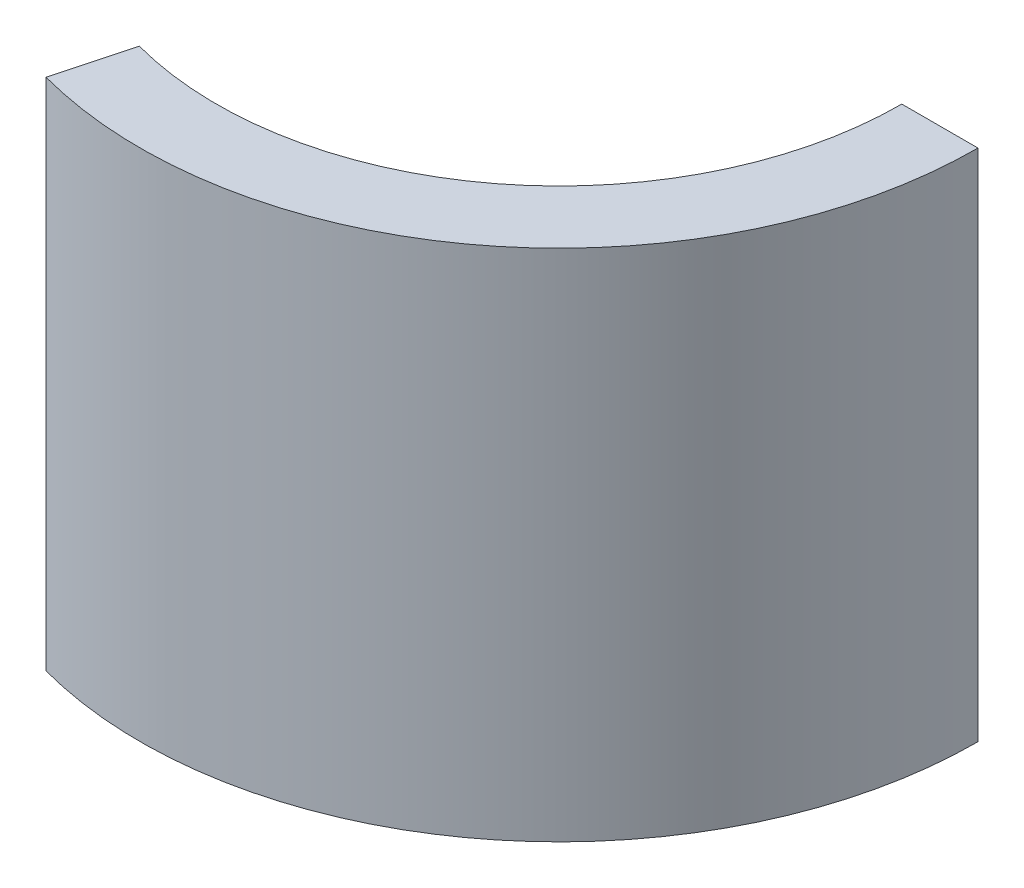
ISO-10303-21;
HEADER;
FILE_DESCRIPTION(('STEP AP214'),'2;1');
FILE_NAME('part.step','',(''),(''),'','','');
FILE_SCHEMA(('AUTOMOTIVE_DESIGN { 1 0 10303 214 1 1 1 1 }'));
ENDSEC;
DATA;
#1=APPLICATION_CONTEXT('core data for automotive mechanical design processes');
#2=APPLICATION_PROTOCOL_DEFINITION('international standard','automotive_design',2000,#1);
#3=PRODUCT_CONTEXT('',#1,'mechanical');
#4=PRODUCT('Part','Part','',(#3));
#5=PRODUCT_RELATED_PRODUCT_CATEGORY('part','',(#4));
#6=PRODUCT_DEFINITION_FORMATION('','',#4);
#7=PRODUCT_DEFINITION_CONTEXT('part definition',#1,'design');
#8=PRODUCT_DEFINITION('design','',#6,#7);
#9=PRODUCT_DEFINITION_SHAPE('','',#8);
#10=(LENGTH_UNIT() NAMED_UNIT(*) SI_UNIT(.MILLI.,.METRE.));
#11=(NAMED_UNIT(*) PLANE_ANGLE_UNIT() SI_UNIT($,.RADIAN.));
#12=(NAMED_UNIT(*) SI_UNIT($,.STERADIAN.) SOLID_ANGLE_UNIT());
#13=UNCERTAINTY_MEASURE_WITH_UNIT(LENGTH_MEASURE(1.E-05),#10,'distance_accuracy_value','');
#14=(GEOMETRIC_REPRESENTATION_CONTEXT(3) GLOBAL_UNCERTAINTY_ASSIGNED_CONTEXT((#13)) GLOBAL_UNIT_ASSIGNED_CONTEXT((#10,
#11,#12)) REPRESENTATION_CONTEXT('',''));
#15=CARTESIAN_POINT('',(0.,0.,0.));
#16=DIRECTION('',(0.,0.,1.));
#17=DIRECTION('',(1.,0.,0.));
#18=AXIS2_PLACEMENT_3D('',#15,#16,#17);
#19=CARTESIAN_POINT('',(0.,27.,0.));
#20=DIRECTION('',(0.,-1.,0.));
#21=DIRECTION('',(0.,0.,-1.));
#22=AXIS2_PLACEMENT_3D('',#19,#20,#21);
#23=CYLINDRICAL_SURFACE('',#22,18.);
#24=CARTESIAN_POINT('',(0.,0.,0.));
#25=DIRECTION('',(0.,-1.,0.));
#26=DIRECTION('',(0.,0.,1.));
#27=AXIS2_PLACEMENT_3D('',#24,#25,#26);
#28=CIRCLE('',#27,18.);
#29=CARTESIAN_POINT('',(18.,0.,0.));
#30=VERTEX_POINT('',#29);
#31=CARTESIAN_POINT('',(-4.65874281184544,0.,17.3866648732032));
#32=VERTEX_POINT('',#31);
#33=EDGE_CURVE('E102',#30,#32,#28,.T.);
#34=ORIENTED_EDGE('',*,*,#33,.T.);
#35=DIRECTION('',(0.,-1.,0.));
#36=VECTOR('',#35,1.);
#37=CARTESIAN_POINT('',(-4.65874281184544,27.,17.3866648732032));
#38=LINE('',#37,#36);
#39=CARTESIAN_POINT('',(-4.65874281184544,27.,17.3866648732032));
#40=VERTEX_POINT('',#39);
#41=EDGE_CURVE('E11',#40,#32,#38,.T.);
#42=ORIENTED_EDGE('',*,*,#41,.F.);
#43=CARTESIAN_POINT('',(0.,27.,0.));
#44=DIRECTION('',(0.,-1.,0.));
#45=DIRECTION('',(0.,0.,1.));
#46=AXIS2_PLACEMENT_3D('',#43,#44,#45);
#47=CIRCLE('',#46,18.);
#48=CARTESIAN_POINT('',(18.,27.,0.));
#49=VERTEX_POINT('',#48);
#50=EDGE_CURVE('E90',#49,#40,#47,.T.);
#51=ORIENTED_EDGE('',*,*,#50,.F.);
#52=DIRECTION('',(0.,-1.,0.));
#53=VECTOR('',#52,1.);
#54=CARTESIAN_POINT('',(18.,27.,0.));
#55=LINE('',#54,#53);
#56=EDGE_CURVE('E98',#49,#30,#55,.T.);
#57=ORIENTED_EDGE('',*,*,#56,.T.);
#58=EDGE_LOOP('',(#34,#42,#51,#57));
#59=FACE_BOUND('',#58,.T.);
#60=ADVANCED_FACE('F39',(#59),#23,.F.);
#61=CARTESIAN_POINT('',(-4.65874281184544,27.,17.3866648732032));
#62=DIRECTION('',(0.965925826289068,0.,0.258819045102524));
#63=DIRECTION('',(0.258819045102524,0.,-0.965925826289067));
#64=AXIS2_PLACEMENT_3D('',#61,#62,#63);
#65=PLANE('',#64);
#66=DIRECTION('',(-0.258819045102524,0.,0.965925826289067));
#67=VECTOR('',#66,1.);
#68=CARTESIAN_POINT('',(-4.65874281184544,0.,17.3866648732032));
#69=LINE('',#68,#67);
#70=CARTESIAN_POINT('',(-5.69401899225555,0.,21.2503681783595));
#71=VERTEX_POINT('',#70);
#72=EDGE_CURVE('E94',#32,#71,#69,.T.);
#73=ORIENTED_EDGE('',*,*,#72,.T.);
#74=DIRECTION('',(0.,-1.,0.));
#75=VECTOR('',#74,1.);
#76=CARTESIAN_POINT('',(-5.69401899225555,27.,21.2503681783595));
#77=LINE('',#76,#75);
#78=CARTESIAN_POINT('',(-5.69401899225555,27.,21.2503681783595));
#79=VERTEX_POINT('',#78);
#80=EDGE_CURVE('E47',#79,#71,#77,.T.);
#81=ORIENTED_EDGE('',*,*,#80,.F.);
#82=DIRECTION('',(-0.258819045102524,0.,0.965925826289067));
#83=VECTOR('',#82,1.);
#84=CARTESIAN_POINT('',(-4.65874281184544,27.,17.3866648732032));
#85=LINE('',#84,#83);
#86=EDGE_CURVE('E85',#40,#79,#85,.T.);
#87=ORIENTED_EDGE('',*,*,#86,.F.);
#88=ORIENTED_EDGE('',*,*,#41,.T.);
#89=EDGE_LOOP('',(#73,#81,#87,#88));
#90=FACE_BOUND('',#89,.T.);
#91=ADVANCED_FACE('F93',(#90),#65,.F.);
#92=CARTESIAN_POINT('',(0.,27.,0.));
#93=DIRECTION('',(0.,-1.,0.));
#94=DIRECTION('',(0.,0.,-1.));
#95=AXIS2_PLACEMENT_3D('',#92,#93,#94);
#96=CYLINDRICAL_SURFACE('',#95,22.);
#97=CARTESIAN_POINT('',(0.,0.,0.));
#98=DIRECTION('',(0.,1.,0.));
#99=DIRECTION('',(0.,0.,1.));
#100=AXIS2_PLACEMENT_3D('',#97,#98,#99);
#101=CIRCLE('',#100,22.);
#102=CARTESIAN_POINT('',(22.,0.,0.));
#103=VERTEX_POINT('',#102);
#104=EDGE_CURVE('E72',#71,#103,#101,.T.);
#105=ORIENTED_EDGE('',*,*,#104,.T.);
#106=DIRECTION('',(0.,-1.,0.));
#107=VECTOR('',#106,1.);
#108=CARTESIAN_POINT('',(22.,27.,0.));
#109=LINE('',#108,#107);
#110=CARTESIAN_POINT('',(22.,27.,0.));
#111=VERTEX_POINT('',#110);
#112=EDGE_CURVE('E95',#111,#103,#109,.T.);
#113=ORIENTED_EDGE('',*,*,#112,.F.);
#114=CARTESIAN_POINT('',(0.,27.,0.));
#115=DIRECTION('',(0.,1.,0.));
#116=DIRECTION('',(0.,0.,1.));
#117=AXIS2_PLACEMENT_3D('',#114,#115,#116);
#118=CIRCLE('',#117,22.);
#119=EDGE_CURVE('E88',#79,#111,#118,.T.);
#120=ORIENTED_EDGE('',*,*,#119,.F.);
#121=ORIENTED_EDGE('',*,*,#80,.T.);
#122=EDGE_LOOP('',(#105,#113,#120,#121));
#123=FACE_BOUND('',#122,.T.);
#124=ADVANCED_FACE('F96',(#123),#96,.T.);
#125=CARTESIAN_POINT('',(18.,27.,0.));
#126=DIRECTION('',(0.,0.,1.));
#127=DIRECTION('',(1.,0.,0.));
#128=AXIS2_PLACEMENT_3D('',#125,#126,#127);
#129=PLANE('',#128);
#130=DIRECTION('',(-1.,0.,0.));
#131=VECTOR('',#130,1.);
#132=CARTESIAN_POINT('',(18.,0.,0.));
#133=LINE('',#132,#131);
#134=EDGE_CURVE('E78',#103,#30,#133,.T.);
#135=ORIENTED_EDGE('',*,*,#134,.T.);
#136=ORIENTED_EDGE('',*,*,#56,.F.);
#137=DIRECTION('',(-1.,0.,0.));
#138=VECTOR('',#137,1.);
#139=CARTESIAN_POINT('',(18.,27.,0.));
#140=LINE('',#139,#138);
#141=EDGE_CURVE('E55',#111,#49,#140,.T.);
#142=ORIENTED_EDGE('',*,*,#141,.F.);
#143=ORIENTED_EDGE('',*,*,#112,.T.);
#144=EDGE_LOOP('',(#135,#136,#142,#143));
#145=FACE_BOUND('',#144,.T.);
#146=ADVANCED_FACE('F109',(#145),#129,.F.);
#147=CARTESIAN_POINT('',(0.,27.,0.));
#148=DIRECTION('',(0.,1.,0.));
#149=DIRECTION('',(0.,0.,1.));
#150=AXIS2_PLACEMENT_3D('',#147,#148,#149);
#151=PLANE('',#150);
#152=ORIENTED_EDGE('',*,*,#50,.T.);
#153=ORIENTED_EDGE('',*,*,#86,.T.);
#154=ORIENTED_EDGE('',*,*,#119,.T.);
#155=ORIENTED_EDGE('',*,*,#141,.T.);
#156=EDGE_LOOP('',(#152,#153,#154,#155));
#157=FACE_BOUND('',#156,.T.);
#158=ADVANCED_FACE('F86',(#157),#151,.T.);
#159=CARTESIAN_POINT('',(0.,0.,0.));
#160=DIRECTION('',(0.,1.,0.));
#161=DIRECTION('',(0.,0.,1.));
#162=AXIS2_PLACEMENT_3D('',#159,#160,#161);
#163=PLANE('',#162);
#164=ORIENTED_EDGE('',*,*,#33,.F.);
#165=ORIENTED_EDGE('',*,*,#134,.F.);
#166=ORIENTED_EDGE('',*,*,#104,.F.);
#167=ORIENTED_EDGE('',*,*,#72,.F.);
#168=EDGE_LOOP('',(#164,#165,#166,#167));
#169=FACE_BOUND('',#168,.T.);
#170=ADVANCED_FACE('F112',(#169),#163,.F.);
#171=CLOSED_SHELL('',(#60,#91,#124,#146,#158,#170));
#172=MANIFOLD_SOLID_BREP('B2',#171);
#173=ADVANCED_BREP_SHAPE_REPRESENTATION('',(#18,#172),#14);
#174=SHAPE_DEFINITION_REPRESENTATION(#9,#173);
ENDSEC;
END-ISO-10303-21;
